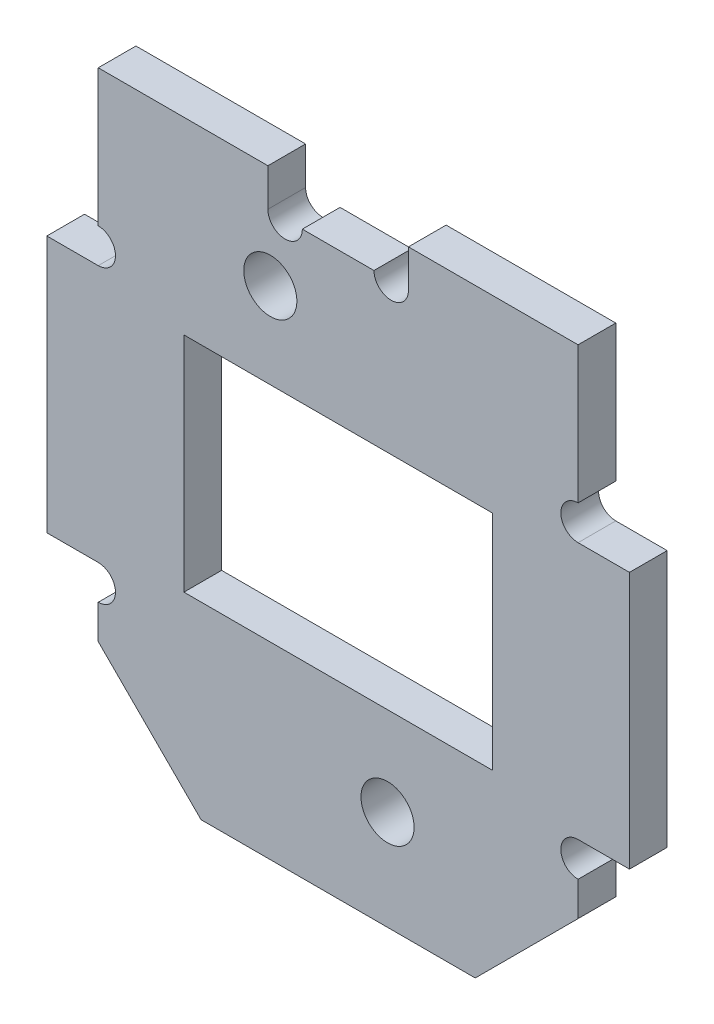
ISO-10303-21;
HEADER;
FILE_DESCRIPTION(('STEP AP214'),'2;1');
FILE_NAME('part.step','',(''),(''),'','','');
FILE_SCHEMA(('AUTOMOTIVE_DESIGN { 1 0 10303 214 1 1 1 1 }'));
ENDSEC;
DATA;
#1=APPLICATION_CONTEXT('core data for automotive mechanical design processes');
#2=APPLICATION_PROTOCOL_DEFINITION('international standard','automotive_design',2000,#1);
#3=PRODUCT_CONTEXT('',#1,'mechanical');
#4=PRODUCT('Part','Part','',(#3));
#5=PRODUCT_RELATED_PRODUCT_CATEGORY('part','',(#4));
#6=PRODUCT_DEFINITION_FORMATION('','',#4);
#7=PRODUCT_DEFINITION_CONTEXT('part definition',#1,'design');
#8=PRODUCT_DEFINITION('design','',#6,#7);
#9=PRODUCT_DEFINITION_SHAPE('','',#8);
#10=(LENGTH_UNIT() NAMED_UNIT(*) SI_UNIT(.MILLI.,.METRE.));
#11=(NAMED_UNIT(*) PLANE_ANGLE_UNIT() SI_UNIT($,.RADIAN.));
#12=(NAMED_UNIT(*) SI_UNIT($,.STERADIAN.) SOLID_ANGLE_UNIT());
#13=UNCERTAINTY_MEASURE_WITH_UNIT(LENGTH_MEASURE(1.E-05),#10,'distance_accuracy_value','');
#14=(GEOMETRIC_REPRESENTATION_CONTEXT(3) GLOBAL_UNCERTAINTY_ASSIGNED_CONTEXT((#13)) GLOBAL_UNIT_ASSIGNED_CONTEXT((#10,
#11,#12)) REPRESENTATION_CONTEXT('',''));
#15=CARTESIAN_POINT('',(0.,0.,0.));
#16=DIRECTION('',(0.,0.,1.));
#17=DIRECTION('',(1.,0.,0.));
#18=AXIS2_PLACEMENT_3D('',#15,#16,#17);
#19=CARTESIAN_POINT('',(0.,7.5,2.2));
#20=DIRECTION('',(0.,1.,0.));
#21=DIRECTION('',(0.,0.,1.));
#22=AXIS2_PLACEMENT_3D('',#19,#20,#21);
#23=PLANE('',#22);
#24=DIRECTION('',(1.,0.,0.));
#25=VECTOR('',#24,1.);
#26=CARTESIAN_POINT('',(0.,7.5,0.));
#27=LINE('',#26,#25);
#28=CARTESIAN_POINT('',(14.,7.5,0.));
#29=VERTEX_POINT('',#28);
#30=CARTESIAN_POINT('',(17.,7.5,0.));
#31=VERTEX_POINT('',#30);
#32=EDGE_CURVE('E366',#29,#31,#27,.T.);
#33=ORIENTED_EDGE('',*,*,#32,.F.);
#34=DIRECTION('',(0.,0.,-1.));
#35=VECTOR('',#34,1.);
#36=CARTESIAN_POINT('',(14.,7.5,2.2));
#37=LINE('',#36,#35);
#38=CARTESIAN_POINT('',(14.,7.5,2.2));
#39=VERTEX_POINT('',#38);
#40=EDGE_CURVE('E258',#39,#29,#37,.T.);
#41=ORIENTED_EDGE('',*,*,#40,.F.);
#42=DIRECTION('',(1.,0.,0.));
#43=VECTOR('',#42,1.);
#44=CARTESIAN_POINT('',(0.,7.5,2.2));
#45=LINE('',#44,#43);
#46=CARTESIAN_POINT('',(17.,7.5,2.2));
#47=VERTEX_POINT('',#46);
#48=EDGE_CURVE('E496',#39,#47,#45,.T.);
#49=ORIENTED_EDGE('',*,*,#48,.T.);
#50=DIRECTION('',(0.,0.,-1.));
#51=VECTOR('',#50,1.);
#52=CARTESIAN_POINT('',(17.,7.5,2.2));
#53=LINE('',#52,#51);
#54=EDGE_CURVE('E246',#47,#31,#53,.T.);
#55=ORIENTED_EDGE('',*,*,#54,.T.);
#56=EDGE_LOOP('',(#33,#41,#49,#55));
#57=FACE_BOUND('',#56,.T.);
#58=ADVANCED_FACE('F36',(#57),#23,.T.);
#59=CARTESIAN_POINT('',(14.,8.505,2.2));
#60=DIRECTION('',(0.,0.,-1.));
#61=DIRECTION('',(-1.,0.,0.));
#62=AXIS2_PLACEMENT_3D('',#59,#60,#61);
#63=CYLINDRICAL_SURFACE('',#62,1.005);
#64=CARTESIAN_POINT('',(14.,8.505,0.));
#65=DIRECTION('',(0.,0.,1.));
#66=DIRECTION('',(1.,0.,0.));
#67=AXIS2_PLACEMENT_3D('',#64,#65,#66);
#68=CIRCLE('',#67,1.005);
#69=CARTESIAN_POINT('',(14.,9.51,0.));
#70=VERTEX_POINT('',#69);
#71=EDGE_CURVE('E369',#29,#70,#68,.F.);
#72=ORIENTED_EDGE('',*,*,#71,.T.);
#73=DIRECTION('',(0.,0.,-1.));
#74=VECTOR('',#73,1.);
#75=CARTESIAN_POINT('',(14.,9.51,2.2));
#76=LINE('',#75,#74);
#77=CARTESIAN_POINT('',(14.,9.51,2.2));
#78=VERTEX_POINT('',#77);
#79=EDGE_CURVE('E347',#78,#70,#76,.T.);
#80=ORIENTED_EDGE('',*,*,#79,.F.);
#81=CARTESIAN_POINT('',(14.,8.505,2.2));
#82=DIRECTION('',(0.,0.,1.));
#83=DIRECTION('',(1.,0.,0.));
#84=AXIS2_PLACEMENT_3D('',#81,#82,#83);
#85=CIRCLE('',#84,1.005);
#86=EDGE_CURVE('E771',#39,#78,#85,.F.);
#87=ORIENTED_EDGE('',*,*,#86,.F.);
#88=ORIENTED_EDGE('',*,*,#40,.T.);
#89=EDGE_LOOP('',(#72,#80,#87,#88));
#90=FACE_BOUND('',#89,.T.);
#91=ADVANCED_FACE('F490',(#90),#63,.F.);
#92=CARTESIAN_POINT('',(14.,0.,2.2));
#93=DIRECTION('',(-1.,0.,0.));
#94=DIRECTION('',(0.,-1.,0.));
#95=AXIS2_PLACEMENT_3D('',#92,#93,#94);
#96=PLANE('',#95);
#97=DIRECTION('',(0.,1.,0.));
#98=VECTOR('',#97,1.);
#99=CARTESIAN_POINT('',(14.,0.,0.));
#100=LINE('',#99,#98);
#101=CARTESIAN_POINT('',(14.,17.5,0.));
#102=VERTEX_POINT('',#101);
#103=EDGE_CURVE('E375',#70,#102,#100,.T.);
#104=ORIENTED_EDGE('',*,*,#103,.T.);
#105=DIRECTION('',(0.,0.,-1.));
#106=VECTOR('',#105,1.);
#107=CARTESIAN_POINT('',(14.,17.5,2.2));
#108=LINE('',#107,#106);
#109=CARTESIAN_POINT('',(14.,17.5,2.2));
#110=VERTEX_POINT('',#109);
#111=EDGE_CURVE('E344',#110,#102,#108,.T.);
#112=ORIENTED_EDGE('',*,*,#111,.F.);
#113=DIRECTION('',(0.,1.,0.));
#114=VECTOR('',#113,1.);
#115=CARTESIAN_POINT('',(14.,0.,2.2));
#116=LINE('',#115,#114);
#117=EDGE_CURVE('E486',#78,#110,#116,.T.);
#118=ORIENTED_EDGE('',*,*,#117,.F.);
#119=ORIENTED_EDGE('',*,*,#79,.T.);
#120=EDGE_LOOP('',(#104,#112,#118,#119));
#121=FACE_BOUND('',#120,.T.);
#122=ADVANCED_FACE('F484',(#121),#96,.F.);
#123=CARTESIAN_POINT('',(0.,17.5,2.2));
#124=DIRECTION('',(0.,-1.,0.));
#125=DIRECTION('',(1.,0.,0.));
#126=AXIS2_PLACEMENT_3D('',#123,#124,#125);
#127=PLANE('',#126);
#128=DIRECTION('',(-1.,0.,0.));
#129=VECTOR('',#128,1.);
#130=CARTESIAN_POINT('',(0.,17.5,0.));
#131=LINE('',#130,#129);
#132=CARTESIAN_POINT('',(4.1,17.5,0.));
#133=VERTEX_POINT('',#132);
#134=EDGE_CURVE('E378',#102,#133,#131,.T.);
#135=ORIENTED_EDGE('',*,*,#134,.T.);
#136=DIRECTION('',(0.,0.,-1.));
#137=VECTOR('',#136,1.);
#138=CARTESIAN_POINT('',(4.1,17.5,2.2));
#139=LINE('',#138,#137);
#140=CARTESIAN_POINT('',(4.1,17.5,2.2));
#141=VERTEX_POINT('',#140);
#142=EDGE_CURVE('E342',#141,#133,#139,.T.);
#143=ORIENTED_EDGE('',*,*,#142,.F.);
#144=DIRECTION('',(-1.,0.,0.));
#145=VECTOR('',#144,1.);
#146=CARTESIAN_POINT('',(0.,17.5,2.2));
#147=LINE('',#146,#145);
#148=EDGE_CURVE('E481',#110,#141,#147,.T.);
#149=ORIENTED_EDGE('',*,*,#148,.F.);
#150=ORIENTED_EDGE('',*,*,#111,.T.);
#151=EDGE_LOOP('',(#135,#143,#149,#150));
#152=FACE_BOUND('',#151,.T.);
#153=ADVANCED_FACE('F480',(#152),#127,.F.);
#154=CARTESIAN_POINT('',(4.1,0.,2.2));
#155=DIRECTION('',(-1.,0.,0.));
#156=DIRECTION('',(0.,0.,1.));
#157=AXIS2_PLACEMENT_3D('',#154,#155,#156);
#158=PLANE('',#157);
#159=DIRECTION('',(0.,1.,0.));
#160=VECTOR('',#159,1.);
#161=CARTESIAN_POINT('',(4.1,0.,0.));
#162=LINE('',#161,#160);
#163=CARTESIAN_POINT('',(4.1,15.3,0.));
#164=VERTEX_POINT('',#163);
#165=EDGE_CURVE('E381',#164,#133,#162,.T.);
#166=ORIENTED_EDGE('',*,*,#165,.F.);
#167=DIRECTION('',(0.,0.,-1.));
#168=VECTOR('',#167,1.);
#169=CARTESIAN_POINT('',(4.1,15.3,2.2));
#170=LINE('',#169,#168);
#171=CARTESIAN_POINT('',(4.1,15.3,2.2));
#172=VERTEX_POINT('',#171);
#173=EDGE_CURVE('E340',#172,#164,#170,.T.);
#174=ORIENTED_EDGE('',*,*,#173,.F.);
#175=DIRECTION('',(0.,1.,0.));
#176=VECTOR('',#175,1.);
#177=CARTESIAN_POINT('',(4.1,0.,2.2));
#178=LINE('',#177,#176);
#179=EDGE_CURVE('E767',#172,#141,#178,.T.);
#180=ORIENTED_EDGE('',*,*,#179,.T.);
#181=ORIENTED_EDGE('',*,*,#142,.T.);
#182=EDGE_LOOP('',(#166,#174,#180,#181));
#183=FACE_BOUND('',#182,.T.);
#184=ADVANCED_FACE('F475',(#183),#158,.T.);
#185=CARTESIAN_POINT('',(3.095,15.3,2.2));
#186=DIRECTION('',(0.,0.,-1.));
#187=DIRECTION('',(-1.,0.,0.));
#188=AXIS2_PLACEMENT_3D('',#185,#186,#187);
#189=CYLINDRICAL_SURFACE('',#188,1.005);
#190=CARTESIAN_POINT('',(3.095,15.3,0.));
#191=DIRECTION('',(0.,0.,1.));
#192=DIRECTION('',(1.,0.,0.));
#193=AXIS2_PLACEMENT_3D('',#190,#191,#192);
#194=CIRCLE('',#193,1.005);
#195=CARTESIAN_POINT('',(2.09,15.3,0.));
#196=VERTEX_POINT('',#195);
#197=EDGE_CURVE('E384',#196,#164,#194,.T.);
#198=ORIENTED_EDGE('',*,*,#197,.F.);
#199=DIRECTION('',(0.,0.,-1.));
#200=VECTOR('',#199,1.);
#201=CARTESIAN_POINT('',(2.09,15.3,2.2));
#202=LINE('',#201,#200);
#203=CARTESIAN_POINT('',(2.09,15.3,2.2));
#204=VERTEX_POINT('',#203);
#205=EDGE_CURVE('E338',#204,#196,#202,.T.);
#206=ORIENTED_EDGE('',*,*,#205,.F.);
#207=CARTESIAN_POINT('',(3.095,15.3,2.2));
#208=DIRECTION('',(0.,0.,1.));
#209=DIRECTION('',(1.,0.,0.));
#210=AXIS2_PLACEMENT_3D('',#207,#208,#209);
#211=CIRCLE('',#210,1.005);
#212=EDGE_CURVE('E471',#204,#172,#211,.T.);
#213=ORIENTED_EDGE('',*,*,#212,.T.);
#214=ORIENTED_EDGE('',*,*,#173,.T.);
#215=EDGE_LOOP('',(#198,#206,#213,#214));
#216=FACE_BOUND('',#215,.T.);
#217=ADVANCED_FACE('F469',(#216),#189,.F.);
#218=CARTESIAN_POINT('',(0.,15.3,2.2));
#219=DIRECTION('',(0.,1.,0.));
#220=DIRECTION('',(0.,0.,1.));
#221=AXIS2_PLACEMENT_3D('',#218,#219,#220);
#222=PLANE('',#221);
#223=DIRECTION('',(1.,0.,0.));
#224=VECTOR('',#223,1.);
#225=CARTESIAN_POINT('',(0.,15.3,0.));
#226=LINE('',#225,#224);
#227=CARTESIAN_POINT('',(-2.09,15.3,0.));
#228=VERTEX_POINT('',#227);
#229=EDGE_CURVE('E387',#228,#196,#226,.T.);
#230=ORIENTED_EDGE('',*,*,#229,.F.);
#231=DIRECTION('',(0.,0.,-1.));
#232=VECTOR('',#231,1.);
#233=CARTESIAN_POINT('',(-2.09,15.3,2.2));
#234=LINE('',#233,#232);
#235=CARTESIAN_POINT('',(-2.09,15.3,2.2));
#236=VERTEX_POINT('',#235);
#237=EDGE_CURVE('E336',#236,#228,#234,.T.);
#238=ORIENTED_EDGE('',*,*,#237,.F.);
#239=DIRECTION('',(1.,0.,0.));
#240=VECTOR('',#239,1.);
#241=CARTESIAN_POINT('',(0.,15.3,2.2));
#242=LINE('',#241,#240);
#243=EDGE_CURVE('E465',#236,#204,#242,.T.);
#244=ORIENTED_EDGE('',*,*,#243,.T.);
#245=ORIENTED_EDGE('',*,*,#205,.T.);
#246=EDGE_LOOP('',(#230,#238,#244,#245));
#247=FACE_BOUND('',#246,.T.);
#248=ADVANCED_FACE('F462',(#247),#222,.T.);
#249=CARTESIAN_POINT('',(-3.095,15.3,2.2));
#250=DIRECTION('',(0.,0.,-1.));
#251=DIRECTION('',(-1.,0.,0.));
#252=AXIS2_PLACEMENT_3D('',#249,#250,#251);
#253=CYLINDRICAL_SURFACE('',#252,1.005);
#254=CARTESIAN_POINT('',(-3.095,15.3,0.));
#255=DIRECTION('',(0.,0.,1.));
#256=DIRECTION('',(1.,0.,0.));
#257=AXIS2_PLACEMENT_3D('',#254,#255,#256);
#258=CIRCLE('',#257,1.005);
#259=CARTESIAN_POINT('',(-4.1,15.3,0.));
#260=VERTEX_POINT('',#259);
#261=EDGE_CURVE('E390',#260,#228,#258,.T.);
#262=ORIENTED_EDGE('',*,*,#261,.F.);
#263=DIRECTION('',(0.,0.,-1.));
#264=VECTOR('',#263,1.);
#265=CARTESIAN_POINT('',(-4.1,15.3,2.2));
#266=LINE('',#265,#264);
#267=CARTESIAN_POINT('',(-4.1,15.3,2.2));
#268=VERTEX_POINT('',#267);
#269=EDGE_CURVE('E334',#268,#260,#266,.T.);
#270=ORIENTED_EDGE('',*,*,#269,.F.);
#271=CARTESIAN_POINT('',(-3.095,15.3,2.2));
#272=DIRECTION('',(0.,0.,1.));
#273=DIRECTION('',(1.,0.,0.));
#274=AXIS2_PLACEMENT_3D('',#271,#272,#273);
#275=CIRCLE('',#274,1.005);
#276=EDGE_CURVE('E763',#268,#236,#275,.T.);
#277=ORIENTED_EDGE('',*,*,#276,.T.);
#278=ORIENTED_EDGE('',*,*,#237,.T.);
#279=EDGE_LOOP('',(#262,#270,#277,#278));
#280=FACE_BOUND('',#279,.T.);
#281=ADVANCED_FACE('F458',(#280),#253,.F.);
#282=CARTESIAN_POINT('',(-4.1,0.,2.2));
#283=DIRECTION('',(1.,0.,0.));
#284=DIRECTION('',(0.,0.,-1.));
#285=AXIS2_PLACEMENT_3D('',#282,#283,#284);
#286=PLANE('',#285);
#287=DIRECTION('',(0.,-1.,0.));
#288=VECTOR('',#287,1.);
#289=CARTESIAN_POINT('',(-4.1,0.,0.));
#290=LINE('',#289,#288);
#291=CARTESIAN_POINT('',(-4.1,17.5,0.));
#292=VERTEX_POINT('',#291);
#293=EDGE_CURVE('E393',#292,#260,#290,.T.);
#294=ORIENTED_EDGE('',*,*,#293,.F.);
#295=DIRECTION('',(0.,0.,-1.));
#296=VECTOR('',#295,1.);
#297=CARTESIAN_POINT('',(-4.1,17.5,2.2));
#298=LINE('',#297,#296);
#299=CARTESIAN_POINT('',(-4.1,17.5,2.2));
#300=VERTEX_POINT('',#299);
#301=EDGE_CURVE('E332',#300,#292,#298,.T.);
#302=ORIENTED_EDGE('',*,*,#301,.F.);
#303=DIRECTION('',(0.,-1.,0.));
#304=VECTOR('',#303,1.);
#305=CARTESIAN_POINT('',(-4.1,0.,2.2));
#306=LINE('',#305,#304);
#307=EDGE_CURVE('E454',#300,#268,#306,.T.);
#308=ORIENTED_EDGE('',*,*,#307,.T.);
#309=ORIENTED_EDGE('',*,*,#269,.T.);
#310=EDGE_LOOP('',(#294,#302,#308,#309));
#311=FACE_BOUND('',#310,.T.);
#312=ADVANCED_FACE('F449',(#311),#286,.T.);
#313=CARTESIAN_POINT('',(0.,17.5,2.2));
#314=DIRECTION('',(0.,-1.,0.));
#315=DIRECTION('',(1.,0.,0.));
#316=AXIS2_PLACEMENT_3D('',#313,#314,#315);
#317=PLANE('',#316);
#318=DIRECTION('',(-1.,0.,0.));
#319=VECTOR('',#318,1.);
#320=CARTESIAN_POINT('',(0.,17.5,0.));
#321=LINE('',#320,#319);
#322=CARTESIAN_POINT('',(-14.,17.5,0.));
#323=VERTEX_POINT('',#322);
#324=EDGE_CURVE('E396',#292,#323,#321,.T.);
#325=ORIENTED_EDGE('',*,*,#324,.T.);
#326=DIRECTION('',(0.,0.,-1.));
#327=VECTOR('',#326,1.);
#328=CARTESIAN_POINT('',(-14.,17.5,2.2));
#329=LINE('',#328,#327);
#330=CARTESIAN_POINT('',(-14.,17.5,2.2));
#331=VERTEX_POINT('',#330);
#332=EDGE_CURVE('E330',#331,#323,#329,.T.);
#333=ORIENTED_EDGE('',*,*,#332,.F.);
#334=DIRECTION('',(-1.,0.,0.));
#335=VECTOR('',#334,1.);
#336=CARTESIAN_POINT('',(0.,17.5,2.2));
#337=LINE('',#336,#335);
#338=EDGE_CURVE('E760',#300,#331,#337,.T.);
#339=ORIENTED_EDGE('',*,*,#338,.F.);
#340=ORIENTED_EDGE('',*,*,#301,.T.);
#341=EDGE_LOOP('',(#325,#333,#339,#340));
#342=FACE_BOUND('',#341,.T.);
#343=ADVANCED_FACE('F581',(#342),#317,.F.);
#344=CARTESIAN_POINT('',(-14.,0.,2.2));
#345=DIRECTION('',(-1.,0.,0.));
#346=DIRECTION('',(0.,0.,1.));
#347=AXIS2_PLACEMENT_3D('',#344,#345,#346);
#348=PLANE('',#347);
#349=DIRECTION('',(0.,1.,0.));
#350=VECTOR('',#349,1.);
#351=CARTESIAN_POINT('',(-14.,0.,0.));
#352=LINE('',#351,#350);
#353=CARTESIAN_POINT('',(-14.,9.51,0.));
#354=VERTEX_POINT('',#353);
#355=EDGE_CURVE('E399',#354,#323,#352,.T.);
#356=ORIENTED_EDGE('',*,*,#355,.F.);
#357=DIRECTION('',(0.,0.,-1.));
#358=VECTOR('',#357,1.);
#359=CARTESIAN_POINT('',(-14.,9.51,2.2));
#360=LINE('',#359,#358);
#361=CARTESIAN_POINT('',(-14.,9.51,2.2));
#362=VERTEX_POINT('',#361);
#363=EDGE_CURVE('E328',#362,#354,#360,.T.);
#364=ORIENTED_EDGE('',*,*,#363,.F.);
#365=DIRECTION('',(0.,1.,0.));
#366=VECTOR('',#365,1.);
#367=CARTESIAN_POINT('',(-14.,0.,2.2));
#368=LINE('',#367,#366);
#369=EDGE_CURVE('E758',#362,#331,#368,.T.);
#370=ORIENTED_EDGE('',*,*,#369,.T.);
#371=ORIENTED_EDGE('',*,*,#332,.T.);
#372=EDGE_LOOP('',(#356,#364,#370,#371));
#373=FACE_BOUND('',#372,.T.);
#374=ADVANCED_FACE('F443',(#373),#348,.T.);
#375=CARTESIAN_POINT('',(-14.,8.505,2.2));
#376=DIRECTION('',(0.,0.,-1.));
#377=DIRECTION('',(-1.,0.,0.));
#378=AXIS2_PLACEMENT_3D('',#375,#376,#377);
#379=CYLINDRICAL_SURFACE('',#378,1.005);
#380=CARTESIAN_POINT('',(-14.,8.505,0.));
#381=DIRECTION('',(0.,0.,1.));
#382=DIRECTION('',(1.,0.,0.));
#383=AXIS2_PLACEMENT_3D('',#380,#381,#382);
#384=CIRCLE('',#383,1.005);
#385=CARTESIAN_POINT('',(-14.,7.5,0.));
#386=VERTEX_POINT('',#385);
#387=EDGE_CURVE('E402',#386,#354,#384,.T.);
#388=ORIENTED_EDGE('',*,*,#387,.F.);
#389=DIRECTION('',(0.,0.,-1.));
#390=VECTOR('',#389,1.);
#391=CARTESIAN_POINT('',(-14.,7.5,2.2));
#392=LINE('',#391,#390);
#393=CARTESIAN_POINT('',(-14.,7.5,2.2));
#394=VERTEX_POINT('',#393);
#395=EDGE_CURVE('E326',#394,#386,#392,.T.);
#396=ORIENTED_EDGE('',*,*,#395,.F.);
#397=CARTESIAN_POINT('',(-14.,8.505,2.2));
#398=DIRECTION('',(0.,0.,1.));
#399=DIRECTION('',(1.,0.,0.));
#400=AXIS2_PLACEMENT_3D('',#397,#398,#399);
#401=CIRCLE('',#400,1.005);
#402=EDGE_CURVE('E439',#394,#362,#401,.T.);
#403=ORIENTED_EDGE('',*,*,#402,.T.);
#404=ORIENTED_EDGE('',*,*,#363,.T.);
#405=EDGE_LOOP('',(#388,#396,#403,#404));
#406=FACE_BOUND('',#405,.T.);
#407=ADVANCED_FACE('F434',(#406),#379,.F.);
#408=CARTESIAN_POINT('',(0.,7.5,2.2));
#409=DIRECTION('',(0.,-1.,0.));
#410=DIRECTION('',(0.,0.,-1.));
#411=AXIS2_PLACEMENT_3D('',#408,#409,#410);
#412=PLANE('',#411);
#413=DIRECTION('',(-1.,0.,0.));
#414=VECTOR('',#413,1.);
#415=CARTESIAN_POINT('',(0.,7.5,0.));
#416=LINE('',#415,#414);
#417=CARTESIAN_POINT('',(-17.,7.5,0.));
#418=VERTEX_POINT('',#417);
#419=EDGE_CURVE('E405',#386,#418,#416,.T.);
#420=ORIENTED_EDGE('',*,*,#419,.T.);
#421=DIRECTION('',(0.,0.,-1.));
#422=VECTOR('',#421,1.);
#423=CARTESIAN_POINT('',(-17.,7.5,2.2));
#424=LINE('',#423,#422);
#425=CARTESIAN_POINT('',(-17.,7.5,2.2));
#426=VERTEX_POINT('',#425);
#427=EDGE_CURVE('E323',#426,#418,#424,.T.);
#428=ORIENTED_EDGE('',*,*,#427,.F.);
#429=DIRECTION('',(-1.,0.,0.));
#430=VECTOR('',#429,1.);
#431=CARTESIAN_POINT('',(0.,7.5,2.2));
#432=LINE('',#431,#430);
#433=EDGE_CURVE('E754',#394,#426,#432,.T.);
#434=ORIENTED_EDGE('',*,*,#433,.F.);
#435=ORIENTED_EDGE('',*,*,#395,.T.);
#436=EDGE_LOOP('',(#420,#428,#434,#435));
#437=FACE_BOUND('',#436,.T.);
#438=ADVANCED_FACE('F574',(#437),#412,.F.);
#439=CARTESIAN_POINT('',(-17.,0.,2.2));
#440=DIRECTION('',(1.,0.,0.));
#441=DIRECTION('',(0.,0.,-1.));
#442=AXIS2_PLACEMENT_3D('',#439,#440,#441);
#443=PLANE('',#442);
#444=DIRECTION('',(0.,-1.,0.));
#445=VECTOR('',#444,1.);
#446=CARTESIAN_POINT('',(-17.,0.,0.));
#447=LINE('',#446,#445);
#448=CARTESIAN_POINT('',(-17.,-7.5,0.));
#449=VERTEX_POINT('',#448);
#450=EDGE_CURVE('E408',#418,#449,#447,.T.);
#451=ORIENTED_EDGE('',*,*,#450,.T.);
#452=DIRECTION('',(0.,0.,-1.));
#453=VECTOR('',#452,1.);
#454=CARTESIAN_POINT('',(-17.,-7.5,2.2));
#455=LINE('',#454,#453);
#456=CARTESIAN_POINT('',(-17.,-7.5,2.2));
#457=VERTEX_POINT('',#456);
#458=EDGE_CURVE('E320',#457,#449,#455,.T.);
#459=ORIENTED_EDGE('',*,*,#458,.F.);
#460=DIRECTION('',(0.,-1.,0.));
#461=VECTOR('',#460,1.);
#462=CARTESIAN_POINT('',(-17.,0.,2.2));
#463=LINE('',#462,#461);
#464=EDGE_CURVE('E752',#426,#457,#463,.T.);
#465=ORIENTED_EDGE('',*,*,#464,.F.);
#466=ORIENTED_EDGE('',*,*,#427,.T.);
#467=EDGE_LOOP('',(#451,#459,#465,#466));
#468=FACE_BOUND('',#467,.T.);
#469=ADVANCED_FACE('F428',(#468),#443,.F.);
#470=CARTESIAN_POINT('',(0.,-7.5,2.2));
#471=DIRECTION('',(0.,1.,0.));
#472=DIRECTION('',(0.,0.,1.));
#473=AXIS2_PLACEMENT_3D('',#470,#471,#472);
#474=PLANE('',#473);
#475=DIRECTION('',(1.,0.,0.));
#476=VECTOR('',#475,1.);
#477=CARTESIAN_POINT('',(0.,-7.5,0.));
#478=LINE('',#477,#476);
#479=CARTESIAN_POINT('',(-14.,-7.5,0.));
#480=VERTEX_POINT('',#479);
#481=EDGE_CURVE('E411',#449,#480,#478,.T.);
#482=ORIENTED_EDGE('',*,*,#481,.T.);
#483=DIRECTION('',(0.,0.,-1.));
#484=VECTOR('',#483,1.);
#485=CARTESIAN_POINT('',(-14.,-7.5,2.2));
#486=LINE('',#485,#484);
#487=CARTESIAN_POINT('',(-14.,-7.5,2.2));
#488=VERTEX_POINT('',#487);
#489=EDGE_CURVE('E318',#488,#480,#486,.T.);
#490=ORIENTED_EDGE('',*,*,#489,.F.);
#491=DIRECTION('',(1.,0.,0.));
#492=VECTOR('',#491,1.);
#493=CARTESIAN_POINT('',(0.,-7.5,2.2));
#494=LINE('',#493,#492);
#495=EDGE_CURVE('E425',#457,#488,#494,.T.);
#496=ORIENTED_EDGE('',*,*,#495,.F.);
#497=ORIENTED_EDGE('',*,*,#458,.T.);
#498=EDGE_LOOP('',(#482,#490,#496,#497));
#499=FACE_BOUND('',#498,.T.);
#500=ADVANCED_FACE('F423',(#499),#474,.F.);
#501=CARTESIAN_POINT('',(-14.,-8.505,2.2));
#502=DIRECTION('',(0.,0.,-1.));
#503=DIRECTION('',(-1.,0.,0.));
#504=AXIS2_PLACEMENT_3D('',#501,#502,#503);
#505=CYLINDRICAL_SURFACE('',#504,1.005);
#506=CARTESIAN_POINT('',(-14.,-8.505,0.));
#507=DIRECTION('',(0.,0.,1.));
#508=DIRECTION('',(1.,0.,0.));
#509=AXIS2_PLACEMENT_3D('',#506,#507,#508);
#510=CIRCLE('',#509,1.005);
#511=CARTESIAN_POINT('',(-14.,-9.51,0.));
#512=VERTEX_POINT('',#511);
#513=EDGE_CURVE('E298',#512,#480,#510,.T.);
#514=ORIENTED_EDGE('',*,*,#513,.F.);
#515=DIRECTION('',(0.,0.,-1.));
#516=VECTOR('',#515,1.);
#517=CARTESIAN_POINT('',(-14.,-9.51,2.2));
#518=LINE('',#517,#516);
#519=CARTESIAN_POINT('',(-14.,-9.51,2.2));
#520=VERTEX_POINT('',#519);
#521=EDGE_CURVE('E315',#520,#512,#518,.T.);
#522=ORIENTED_EDGE('',*,*,#521,.F.);
#523=CARTESIAN_POINT('',(-14.,-8.505,2.2));
#524=DIRECTION('',(0.,0.,1.));
#525=DIRECTION('',(1.,0.,0.));
#526=AXIS2_PLACEMENT_3D('',#523,#524,#525);
#527=CIRCLE('',#526,1.005);
#528=EDGE_CURVE('E421',#520,#488,#527,.T.);
#529=ORIENTED_EDGE('',*,*,#528,.T.);
#530=ORIENTED_EDGE('',*,*,#489,.T.);
#531=EDGE_LOOP('',(#514,#522,#529,#530));
#532=FACE_BOUND('',#531,.T.);
#533=ADVANCED_FACE('F417',(#532),#505,.F.);
#534=CARTESIAN_POINT('',(-14.,0.,2.2));
#535=DIRECTION('',(-1.,0.,0.));
#536=DIRECTION('',(0.,-1.,0.));
#537=AXIS2_PLACEMENT_3D('',#534,#535,#536);
#538=PLANE('',#537);
#539=DIRECTION('',(0.,1.,0.));
#540=VECTOR('',#539,1.);
#541=CARTESIAN_POINT('',(-14.,0.,0.));
#542=LINE('',#541,#540);
#543=CARTESIAN_POINT('',(-14.,-11.5,0.));
#544=VERTEX_POINT('',#543);
#545=EDGE_CURVE('E294',#544,#512,#542,.T.);
#546=ORIENTED_EDGE('',*,*,#545,.F.);
#547=DIRECTION('',(0.,0.,1.));
#548=VECTOR('',#547,1.);
#549=CARTESIAN_POINT('',(-14.,-11.5,2.2));
#550=LINE('',#549,#548);
#551=CARTESIAN_POINT('',(-14.,-11.5,2.2));
#552=VERTEX_POINT('',#551);
#553=EDGE_CURVE('E11',#544,#552,#550,.T.);
#554=ORIENTED_EDGE('',*,*,#553,.T.);
#555=DIRECTION('',(0.,1.,0.));
#556=VECTOR('',#555,1.);
#557=CARTESIAN_POINT('',(-14.,0.,2.2));
#558=LINE('',#557,#556);
#559=EDGE_CURVE('E747',#552,#520,#558,.T.);
#560=ORIENTED_EDGE('',*,*,#559,.T.);
#561=ORIENTED_EDGE('',*,*,#521,.T.);
#562=EDGE_LOOP('',(#546,#554,#560,#561));
#563=FACE_BOUND('',#562,.T.);
#564=ADVANCED_FACE('F565',(#563),#538,.T.);
#565=CARTESIAN_POINT('',(0.,-17.5,2.2));
#566=DIRECTION('',(0.,-1.,0.));
#567=DIRECTION('',(0.,0.,-1.));
#568=AXIS2_PLACEMENT_3D('',#565,#566,#567);
#569=PLANE('',#568);
#570=DIRECTION('',(-1.,0.,0.));
#571=VECTOR('',#570,1.);
#572=CARTESIAN_POINT('',(0.,-17.5,0.));
#573=LINE('',#572,#571);
#574=CARTESIAN_POINT('',(7.99999999999997,-17.5,0.));
#575=VERTEX_POINT('',#574);
#576=CARTESIAN_POINT('',(-8.,-17.5,0.));
#577=VERTEX_POINT('',#576);
#578=EDGE_CURVE('E288',#575,#577,#573,.T.);
#579=ORIENTED_EDGE('',*,*,#578,.F.);
#580=DIRECTION('',(0.,0.,1.));
#581=VECTOR('',#580,1.);
#582=CARTESIAN_POINT('',(7.99999999999997,-17.5,2.2));
#583=LINE('',#582,#581);
#584=CARTESIAN_POINT('',(7.99999999999997,-17.5,2.2));
#585=VERTEX_POINT('',#584);
#586=EDGE_CURVE('E265',#575,#585,#583,.T.);
#587=ORIENTED_EDGE('',*,*,#586,.T.);
#588=DIRECTION('',(-1.,0.,0.));
#589=VECTOR('',#588,1.);
#590=CARTESIAN_POINT('',(0.,-17.5,2.2));
#591=LINE('',#590,#589);
#592=CARTESIAN_POINT('',(-8.,-17.5,2.2));
#593=VERTEX_POINT('',#592);
#594=EDGE_CURVE('E271',#585,#593,#591,.T.);
#595=ORIENTED_EDGE('',*,*,#594,.T.);
#596=DIRECTION('',(0.,0.,-1.));
#597=VECTOR('',#596,1.);
#598=CARTESIAN_POINT('',(-8.,-17.5,2.2));
#599=LINE('',#598,#597);
#600=EDGE_CURVE('E262',#593,#577,#599,.T.);
#601=ORIENTED_EDGE('',*,*,#600,.T.);
#602=EDGE_LOOP('',(#579,#587,#595,#601));
#603=FACE_BOUND('',#602,.T.);
#604=ADVANCED_FACE('F292',(#603),#569,.T.);
#605=CARTESIAN_POINT('',(14.,0.,2.2));
#606=DIRECTION('',(-1.,0.,0.));
#607=DIRECTION('',(0.,-1.,0.));
#608=AXIS2_PLACEMENT_3D('',#605,#606,#607);
#609=PLANE('',#608);
#610=DIRECTION('',(0.,1.,0.));
#611=VECTOR('',#610,1.);
#612=CARTESIAN_POINT('',(14.,0.,2.2));
#613=LINE('',#612,#611);
#614=CARTESIAN_POINT('',(14.,-11.5,2.2));
#615=VERTEX_POINT('',#614);
#616=CARTESIAN_POINT('',(14.,-9.51,2.2));
#617=VERTEX_POINT('',#616);
#618=EDGE_CURVE('E269',#615,#617,#613,.T.);
#619=ORIENTED_EDGE('',*,*,#618,.F.);
#620=DIRECTION('',(0.,0.,-1.));
#621=VECTOR('',#620,1.);
#622=CARTESIAN_POINT('',(14.,-11.5,0.));
#623=LINE('',#622,#621);
#624=CARTESIAN_POINT('',(14.,-11.5,0.));
#625=VERTEX_POINT('',#624);
#626=EDGE_CURVE('E254',#615,#625,#623,.T.);
#627=ORIENTED_EDGE('',*,*,#626,.T.);
#628=DIRECTION('',(0.,1.,0.));
#629=VECTOR('',#628,1.);
#630=CARTESIAN_POINT('',(14.,0.,0.));
#631=LINE('',#630,#629);
#632=CARTESIAN_POINT('',(14.,-9.51,0.));
#633=VERTEX_POINT('',#632);
#634=EDGE_CURVE('E290',#625,#633,#631,.T.);
#635=ORIENTED_EDGE('',*,*,#634,.T.);
#636=DIRECTION('',(0.,0.,-1.));
#637=VECTOR('',#636,1.);
#638=CARTESIAN_POINT('',(14.,-9.51,2.2));
#639=LINE('',#638,#637);
#640=EDGE_CURVE('E280',#617,#633,#639,.T.);
#641=ORIENTED_EDGE('',*,*,#640,.F.);
#642=EDGE_LOOP('',(#619,#627,#635,#641));
#643=FACE_BOUND('',#642,.T.);
#644=ADVANCED_FACE('F277',(#643),#609,.F.);
#645=CARTESIAN_POINT('',(14.,-8.505,2.2));
#646=DIRECTION('',(0.,0.,-1.));
#647=DIRECTION('',(-1.,0.,0.));
#648=AXIS2_PLACEMENT_3D('',#645,#646,#647);
#649=CYLINDRICAL_SURFACE('',#648,1.005);
#650=CARTESIAN_POINT('',(14.,-8.505,0.));
#651=DIRECTION('',(0.,0.,1.));
#652=DIRECTION('',(1.,0.,0.));
#653=AXIS2_PLACEMENT_3D('',#650,#651,#652);
#654=CIRCLE('',#653,1.005);
#655=CARTESIAN_POINT('',(14.,-7.5,0.));
#656=VERTEX_POINT('',#655);
#657=EDGE_CURVE('E296',#633,#656,#654,.F.);
#658=ORIENTED_EDGE('',*,*,#657,.T.);
#659=DIRECTION('',(0.,0.,-1.));
#660=VECTOR('',#659,1.);
#661=CARTESIAN_POINT('',(14.,-7.5,2.2));
#662=LINE('',#661,#660);
#663=CARTESIAN_POINT('',(14.,-7.5,2.2));
#664=VERTEX_POINT('',#663);
#665=EDGE_CURVE('E312',#664,#656,#662,.T.);
#666=ORIENTED_EDGE('',*,*,#665,.F.);
#667=CARTESIAN_POINT('',(14.,-8.505,2.2));
#668=DIRECTION('',(0.,0.,1.));
#669=DIRECTION('',(1.,0.,0.));
#670=AXIS2_PLACEMENT_3D('',#667,#668,#669);
#671=CIRCLE('',#670,1.005);
#672=EDGE_CURVE('E281',#617,#664,#671,.F.);
#673=ORIENTED_EDGE('',*,*,#672,.F.);
#674=ORIENTED_EDGE('',*,*,#640,.T.);
#675=EDGE_LOOP('',(#658,#666,#673,#674));
#676=FACE_BOUND('',#675,.T.);
#677=ADVANCED_FACE('F509',(#676),#649,.F.);
#678=CARTESIAN_POINT('',(0.,-7.5,2.2));
#679=DIRECTION('',(0.,-1.,0.));
#680=DIRECTION('',(0.,0.,-1.));
#681=AXIS2_PLACEMENT_3D('',#678,#679,#680);
#682=PLANE('',#681);
#683=DIRECTION('',(-1.,0.,0.));
#684=VECTOR('',#683,1.);
#685=CARTESIAN_POINT('',(0.,-7.5,0.));
#686=LINE('',#685,#684);
#687=CARTESIAN_POINT('',(17.,-7.5,0.));
#688=VERTEX_POINT('',#687);
#689=EDGE_CURVE('E304',#688,#656,#686,.T.);
#690=ORIENTED_EDGE('',*,*,#689,.F.);
#691=DIRECTION('',(0.,0.,-1.));
#692=VECTOR('',#691,1.);
#693=CARTESIAN_POINT('',(17.,-7.5,2.2));
#694=LINE('',#693,#692);
#695=CARTESIAN_POINT('',(17.,-7.5,2.2));
#696=VERTEX_POINT('',#695);
#697=EDGE_CURVE('E248',#696,#688,#694,.T.);
#698=ORIENTED_EDGE('',*,*,#697,.F.);
#699=DIRECTION('',(-1.,0.,0.));
#700=VECTOR('',#699,1.);
#701=CARTESIAN_POINT('',(0.,-7.5,2.2));
#702=LINE('',#701,#700);
#703=EDGE_CURVE('E507',#696,#664,#702,.T.);
#704=ORIENTED_EDGE('',*,*,#703,.T.);
#705=ORIENTED_EDGE('',*,*,#665,.T.);
#706=EDGE_LOOP('',(#690,#698,#704,#705));
#707=FACE_BOUND('',#706,.T.);
#708=ADVANCED_FACE('F503',(#707),#682,.T.);
#709=CARTESIAN_POINT('',(0.,-6.5,2.2));
#710=DIRECTION('',(0.,-1.,0.));
#711=DIRECTION('',(0.,0.,-1.));
#712=AXIS2_PLACEMENT_3D('',#709,#710,#711);
#713=PLANE('',#712);
#714=DIRECTION('',(-1.,0.,0.));
#715=VECTOR('',#714,1.);
#716=CARTESIAN_POINT('',(0.,-6.5,0.));
#717=LINE('',#716,#715);
#718=CARTESIAN_POINT('',(9.,-6.5,0.));
#719=VERTEX_POINT('',#718);
#720=CARTESIAN_POINT('',(-9.,-6.5,0.));
#721=VERTEX_POINT('',#720);
#722=EDGE_CURVE('E245',#719,#721,#717,.T.);
#723=ORIENTED_EDGE('',*,*,#722,.T.);
#724=DIRECTION('',(0.,0.,-1.));
#725=VECTOR('',#724,1.);
#726=CARTESIAN_POINT('',(-9.,-6.5,2.2));
#727=LINE('',#726,#725);
#728=CARTESIAN_POINT('',(-9.,-6.5,2.2));
#729=VERTEX_POINT('',#728);
#730=EDGE_CURVE('E226',#729,#721,#727,.T.);
#731=ORIENTED_EDGE('',*,*,#730,.F.);
#732=DIRECTION('',(-1.,0.,0.));
#733=VECTOR('',#732,1.);
#734=CARTESIAN_POINT('',(0.,-6.5,2.2));
#735=LINE('',#734,#733);
#736=CARTESIAN_POINT('',(9.,-6.5,2.2));
#737=VERTEX_POINT('',#736);
#738=EDGE_CURVE('E233',#737,#729,#735,.T.);
#739=ORIENTED_EDGE('',*,*,#738,.F.);
#740=DIRECTION('',(0.,0.,-1.));
#741=VECTOR('',#740,1.);
#742=CARTESIAN_POINT('',(9.,-6.5,2.2));
#743=LINE('',#742,#741);
#744=EDGE_CURVE('E351',#737,#719,#743,.T.);
#745=ORIENTED_EDGE('',*,*,#744,.T.);
#746=EDGE_LOOP('',(#723,#731,#739,#745));
#747=FACE_BOUND('',#746,.T.);
#748=ADVANCED_FACE('F243',(#747),#713,.F.);
#749=CARTESIAN_POINT('',(-9.,0.,2.2));
#750=DIRECTION('',(-1.,0.,0.));
#751=DIRECTION('',(0.,-1.,0.));
#752=AXIS2_PLACEMENT_3D('',#749,#750,#751);
#753=PLANE('',#752);
#754=DIRECTION('',(0.,1.,0.));
#755=VECTOR('',#754,1.);
#756=CARTESIAN_POINT('',(-9.,0.,0.));
#757=LINE('',#756,#755);
#758=CARTESIAN_POINT('',(-9.,6.5,0.));
#759=VERTEX_POINT('',#758);
#760=EDGE_CURVE('E364',#721,#759,#757,.T.);
#761=ORIENTED_EDGE('',*,*,#760,.T.);
#762=DIRECTION('',(0.,0.,-1.));
#763=VECTOR('',#762,1.);
#764=CARTESIAN_POINT('',(-9.,6.5,2.2));
#765=LINE('',#764,#763);
#766=CARTESIAN_POINT('',(-9.,6.5,2.2));
#767=VERTEX_POINT('',#766);
#768=EDGE_CURVE('E228',#767,#759,#765,.T.);
#769=ORIENTED_EDGE('',*,*,#768,.F.);
#770=DIRECTION('',(0.,1.,0.));
#771=VECTOR('',#770,1.);
#772=CARTESIAN_POINT('',(-9.,0.,2.2));
#773=LINE('',#772,#771);
#774=EDGE_CURVE('E221',#729,#767,#773,.T.);
#775=ORIENTED_EDGE('',*,*,#774,.F.);
#776=ORIENTED_EDGE('',*,*,#730,.T.);
#777=EDGE_LOOP('',(#761,#769,#775,#776));
#778=FACE_BOUND('',#777,.T.);
#779=ADVANCED_FACE('F224',(#778),#753,.F.);
#780=CARTESIAN_POINT('',(0.,6.5,2.2));
#781=DIRECTION('',(0.,-1.,0.));
#782=DIRECTION('',(0.,0.,-1.));
#783=AXIS2_PLACEMENT_3D('',#780,#781,#782);
#784=PLANE('',#783);
#785=DIRECTION('',(-1.,0.,0.));
#786=VECTOR('',#785,1.);
#787=CARTESIAN_POINT('',(0.,6.5,0.));
#788=LINE('',#787,#786);
#789=CARTESIAN_POINT('',(9.,6.5,0.));
#790=VERTEX_POINT('',#789);
#791=EDGE_CURVE('E361',#790,#759,#788,.T.);
#792=ORIENTED_EDGE('',*,*,#791,.F.);
#793=DIRECTION('',(0.,0.,-1.));
#794=VECTOR('',#793,1.);
#795=CARTESIAN_POINT('',(9.,6.5,2.2));
#796=LINE('',#795,#794);
#797=CARTESIAN_POINT('',(9.,6.5,2.2));
#798=VERTEX_POINT('',#797);
#799=EDGE_CURVE('E250',#798,#790,#796,.T.);
#800=ORIENTED_EDGE('',*,*,#799,.F.);
#801=DIRECTION('',(-1.,0.,0.));
#802=VECTOR('',#801,1.);
#803=CARTESIAN_POINT('',(0.,6.5,2.2));
#804=LINE('',#803,#802);
#805=EDGE_CURVE('E232',#798,#767,#804,.T.);
#806=ORIENTED_EDGE('',*,*,#805,.T.);
#807=ORIENTED_EDGE('',*,*,#768,.T.);
#808=EDGE_LOOP('',(#792,#800,#806,#807));
#809=FACE_BOUND('',#808,.T.);
#810=ADVANCED_FACE('F362',(#809),#784,.T.);
#811=CARTESIAN_POINT('',(9.,0.,2.2));
#812=DIRECTION('',(-1.,0.,0.));
#813=DIRECTION('',(0.,0.,1.));
#814=AXIS2_PLACEMENT_3D('',#811,#812,#813);
#815=PLANE('',#814);
#816=DIRECTION('',(0.,1.,0.));
#817=VECTOR('',#816,1.);
#818=CARTESIAN_POINT('',(9.,0.,0.));
#819=LINE('',#818,#817);
#820=EDGE_CURVE('E358',#719,#790,#819,.T.);
#821=ORIENTED_EDGE('',*,*,#820,.F.);
#822=ORIENTED_EDGE('',*,*,#744,.F.);
#823=DIRECTION('',(0.,1.,0.));
#824=VECTOR('',#823,1.);
#825=CARTESIAN_POINT('',(9.,0.,2.2));
#826=LINE('',#825,#824);
#827=EDGE_CURVE('E239',#737,#798,#826,.T.);
#828=ORIENTED_EDGE('',*,*,#827,.T.);
#829=ORIENTED_EDGE('',*,*,#799,.T.);
#830=EDGE_LOOP('',(#821,#822,#828,#829));
#831=FACE_BOUND('',#830,.T.);
#832=ADVANCED_FACE('F356',(#831),#815,.T.);
#833=CARTESIAN_POINT('',(-3.95802860122535,11.5,2.2));
#834=DIRECTION('',(0.,0.,-1.));
#835=DIRECTION('',(-1.,0.,0.));
#836=AXIS2_PLACEMENT_3D('',#833,#834,#835);
#837=CYLINDRICAL_SURFACE('',#836,1.55);
#838=CARTESIAN_POINT('',(-3.95802860122535,11.5,2.2));
#839=DIRECTION('',(0.,0.,1.));
#840=DIRECTION('',(1.,0.,0.));
#841=AXIS2_PLACEMENT_3D('',#838,#839,#840);
#842=CIRCLE('',#841,1.55);
#843=CARTESIAN_POINT('',(-2.40802860122535,11.5,2.2));
#844=VERTEX_POINT('',#843);
#845=EDGE_CURVE('E241',#844,#844,#842,.T.);
#846=ORIENTED_EDGE('',*,*,#845,.T.);
#847=EDGE_LOOP('',(#846));
#848=FACE_BOUND('',#847,.T.);
#849=CARTESIAN_POINT('',(-3.95802860122535,11.5,0.));
#850=DIRECTION('',(0.,0.,1.));
#851=DIRECTION('',(1.,0.,0.));
#852=AXIS2_PLACEMENT_3D('',#849,#850,#851);
#853=CIRCLE('',#852,1.55);
#854=CARTESIAN_POINT('',(-2.40802860122535,11.5,0.));
#855=VERTEX_POINT('',#854);
#856=EDGE_CURVE('E518',#855,#855,#853,.T.);
#857=ORIENTED_EDGE('',*,*,#856,.F.);
#858=EDGE_LOOP('',(#857));
#859=FACE_BOUND('',#858,.T.);
#860=ADVANCED_FACE('F524',(#848,#859),#837,.F.);
#861=CARTESIAN_POINT('',(2.88284386506907,-11.6776285219152,2.2));
#862=DIRECTION('',(0.,0.,-1.));
#863=DIRECTION('',(-1.,0.,0.));
#864=AXIS2_PLACEMENT_3D('',#861,#862,#863);
#865=CYLINDRICAL_SURFACE('',#864,1.55);
#866=CARTESIAN_POINT('',(2.88284386506907,-11.6776285219152,2.2));
#867=DIRECTION('',(0.,0.,1.));
#868=DIRECTION('',(1.,0.,0.));
#869=AXIS2_PLACEMENT_3D('',#866,#867,#868);
#870=CIRCLE('',#869,1.55);
#871=CARTESIAN_POINT('',(4.43284386506907,-11.6776285219152,2.2));
#872=VERTEX_POINT('',#871);
#873=EDGE_CURVE('E309',#872,#872,#870,.T.);
#874=ORIENTED_EDGE('',*,*,#873,.T.);
#875=EDGE_LOOP('',(#874));
#876=FACE_BOUND('',#875,.T.);
#877=CARTESIAN_POINT('',(2.88284386506907,-11.6776285219152,0.));
#878=DIRECTION('',(0.,0.,1.));
#879=DIRECTION('',(1.,0.,0.));
#880=AXIS2_PLACEMENT_3D('',#877,#878,#879);
#881=CIRCLE('',#880,1.55);
#882=CARTESIAN_POINT('',(4.43284386506907,-11.6776285219152,0.));
#883=VERTEX_POINT('',#882);
#884=EDGE_CURVE('E515',#883,#883,#881,.T.);
#885=ORIENTED_EDGE('',*,*,#884,.F.);
#886=EDGE_LOOP('',(#885));
#887=FACE_BOUND('',#886,.T.);
#888=ADVANCED_FACE('F526',(#876,#887),#865,.F.);
#889=CARTESIAN_POINT('',(17.,0.,2.2));
#890=DIRECTION('',(1.,0.,0.));
#891=DIRECTION('',(0.,0.,-1.));
#892=AXIS2_PLACEMENT_3D('',#889,#890,#891);
#893=PLANE('',#892);
#894=DIRECTION('',(0.,-1.,0.));
#895=VECTOR('',#894,1.);
#896=CARTESIAN_POINT('',(17.,0.,0.));
#897=LINE('',#896,#895);
#898=EDGE_CURVE('E307',#31,#688,#897,.T.);
#899=ORIENTED_EDGE('',*,*,#898,.F.);
#900=ORIENTED_EDGE('',*,*,#54,.F.);
#901=DIRECTION('',(0.,-1.,0.));
#902=VECTOR('',#901,1.);
#903=CARTESIAN_POINT('',(17.,0.,2.2));
#904=LINE('',#903,#902);
#905=EDGE_CURVE('E352',#47,#696,#904,.T.);
#906=ORIENTED_EDGE('',*,*,#905,.T.);
#907=ORIENTED_EDGE('',*,*,#697,.T.);
#908=EDGE_LOOP('',(#899,#900,#906,#907));
#909=FACE_BOUND('',#908,.T.);
#910=ADVANCED_FACE('F500',(#909),#893,.T.);
#911=CARTESIAN_POINT('',(0.,0.,2.2));
#912=DIRECTION('',(0.,0.,1.));
#913=DIRECTION('',(1.,0.,0.));
#914=AXIS2_PLACEMENT_3D('',#911,#912,#913);
#915=PLANE('',#914);
#916=ORIENTED_EDGE('',*,*,#873,.F.);
#917=EDGE_LOOP('',(#916));
#918=FACE_BOUND('',#917,.T.);
#919=ORIENTED_EDGE('',*,*,#845,.F.);
#920=EDGE_LOOP('',(#919));
#921=FACE_BOUND('',#920,.T.);
#922=ORIENTED_EDGE('',*,*,#738,.T.);
#923=ORIENTED_EDGE('',*,*,#774,.T.);
#924=ORIENTED_EDGE('',*,*,#805,.F.);
#925=ORIENTED_EDGE('',*,*,#827,.F.);
#926=EDGE_LOOP('',(#922,#923,#924,#925));
#927=FACE_BOUND('',#926,.T.);
#928=ORIENTED_EDGE('',*,*,#594,.F.);
#929=DIRECTION('',(0.707106781186549,0.707106781186546,0.));
#930=VECTOR('',#929,1.);
#931=CARTESIAN_POINT('',(12.75,-12.75,2.2));
#932=LINE('',#931,#930);
#933=EDGE_CURVE('E44',#585,#615,#932,.T.);
#934=ORIENTED_EDGE('',*,*,#933,.T.);
#935=ORIENTED_EDGE('',*,*,#618,.T.);
#936=ORIENTED_EDGE('',*,*,#672,.T.);
#937=ORIENTED_EDGE('',*,*,#703,.F.);
#938=ORIENTED_EDGE('',*,*,#905,.F.);
#939=ORIENTED_EDGE('',*,*,#48,.F.);
#940=ORIENTED_EDGE('',*,*,#86,.T.);
#941=ORIENTED_EDGE('',*,*,#117,.T.);
#942=ORIENTED_EDGE('',*,*,#148,.T.);
#943=ORIENTED_EDGE('',*,*,#179,.F.);
#944=ORIENTED_EDGE('',*,*,#212,.F.);
#945=ORIENTED_EDGE('',*,*,#243,.F.);
#946=ORIENTED_EDGE('',*,*,#276,.F.);
#947=ORIENTED_EDGE('',*,*,#307,.F.);
#948=ORIENTED_EDGE('',*,*,#338,.T.);
#949=ORIENTED_EDGE('',*,*,#369,.F.);
#950=ORIENTED_EDGE('',*,*,#402,.F.);
#951=ORIENTED_EDGE('',*,*,#433,.T.);
#952=ORIENTED_EDGE('',*,*,#464,.T.);
#953=ORIENTED_EDGE('',*,*,#495,.T.);
#954=ORIENTED_EDGE('',*,*,#528,.F.);
#955=ORIENTED_EDGE('',*,*,#559,.F.);
#956=DIRECTION('',(-0.707106781186546,0.707106781186549,0.));
#957=VECTOR('',#956,1.);
#958=CARTESIAN_POINT('',(-12.75,-12.75,2.2));
#959=LINE('',#958,#957);
#960=EDGE_CURVE('E56',#552,#593,#959,.F.);
#961=ORIENTED_EDGE('',*,*,#960,.T.);
#962=EDGE_LOOP('',(#928,#934,#935,#936,#937,#938,#939,#940,#941,#942,#943,#944,#945,#946,#947,
#948,#949,#950,#951,#952,#953,#954,#955,#961));
#963=FACE_BOUND('',#962,.T.);
#964=ADVANCED_FACE('F237',(#918,#921,#927,#963),#915,.T.);
#965=CARTESIAN_POINT('',(0.,0.,0.));
#966=DIRECTION('',(0.,0.,1.));
#967=DIRECTION('',(1.,0.,0.));
#968=AXIS2_PLACEMENT_3D('',#965,#966,#967);
#969=PLANE('',#968);
#970=ORIENTED_EDGE('',*,*,#884,.T.);
#971=EDGE_LOOP('',(#970));
#972=FACE_BOUND('',#971,.T.);
#973=ORIENTED_EDGE('',*,*,#856,.T.);
#974=EDGE_LOOP('',(#973));
#975=FACE_BOUND('',#974,.T.);
#976=ORIENTED_EDGE('',*,*,#722,.F.);
#977=ORIENTED_EDGE('',*,*,#820,.T.);
#978=ORIENTED_EDGE('',*,*,#791,.T.);
#979=ORIENTED_EDGE('',*,*,#760,.F.);
#980=EDGE_LOOP('',(#976,#977,#978,#979));
#981=FACE_BOUND('',#980,.T.);
#982=ORIENTED_EDGE('',*,*,#634,.F.);
#983=DIRECTION('',(-0.707106781186549,-0.707106781186546,0.));
#984=VECTOR('',#983,1.);
#985=CARTESIAN_POINT('',(14.,-11.5,0.));
#986=LINE('',#985,#984);
#987=EDGE_CURVE('E260',#625,#575,#986,.T.);
#988=ORIENTED_EDGE('',*,*,#987,.T.);
#989=ORIENTED_EDGE('',*,*,#578,.T.);
#990=DIRECTION('',(0.707106781186546,-0.707106781186549,0.));
#991=VECTOR('',#990,1.);
#992=CARTESIAN_POINT('',(-8.,-17.5,0.));
#993=LINE('',#992,#991);
#994=EDGE_CURVE('E257',#577,#544,#993,.F.);
#995=ORIENTED_EDGE('',*,*,#994,.T.);
#996=ORIENTED_EDGE('',*,*,#545,.T.);
#997=ORIENTED_EDGE('',*,*,#513,.T.);
#998=ORIENTED_EDGE('',*,*,#481,.F.);
#999=ORIENTED_EDGE('',*,*,#450,.F.);
#1000=ORIENTED_EDGE('',*,*,#419,.F.);
#1001=ORIENTED_EDGE('',*,*,#387,.T.);
#1002=ORIENTED_EDGE('',*,*,#355,.T.);
#1003=ORIENTED_EDGE('',*,*,#324,.F.);
#1004=ORIENTED_EDGE('',*,*,#293,.T.);
#1005=ORIENTED_EDGE('',*,*,#261,.T.);
#1006=ORIENTED_EDGE('',*,*,#229,.T.);
#1007=ORIENTED_EDGE('',*,*,#197,.T.);
#1008=ORIENTED_EDGE('',*,*,#165,.T.);
#1009=ORIENTED_EDGE('',*,*,#134,.F.);
#1010=ORIENTED_EDGE('',*,*,#103,.F.);
#1011=ORIENTED_EDGE('',*,*,#71,.F.);
#1012=ORIENTED_EDGE('',*,*,#32,.T.);
#1013=ORIENTED_EDGE('',*,*,#898,.T.);
#1014=ORIENTED_EDGE('',*,*,#689,.T.);
#1015=ORIENTED_EDGE('',*,*,#657,.F.);
#1016=EDGE_LOOP('',(#982,#988,#989,#995,#996,#997,#998,#999,#1000,#1001,#1002,#1003,#1004,#1005,
#1006,#1007,#1008,#1009,#1010,#1011,#1012,#1013,#1014,#1015));
#1017=FACE_BOUND('',#1016,.T.);
#1018=ADVANCED_FACE('F287',(#972,#975,#981,#1017),#969,.F.);
#1019=CARTESIAN_POINT('',(14.,-11.5,2.2));
#1020=DIRECTION('',(0.707106781186546,-0.707106781186549,0.));
#1021=DIRECTION('',(0.,0.,1.));
#1022=AXIS2_PLACEMENT_3D('',#1019,#1020,#1021);
#1023=PLANE('',#1022);
#1024=ORIENTED_EDGE('',*,*,#933,.F.);
#1025=ORIENTED_EDGE('',*,*,#586,.F.);
#1026=ORIENTED_EDGE('',*,*,#987,.F.);
#1027=ORIENTED_EDGE('',*,*,#626,.F.);
#1028=EDGE_LOOP('',(#1024,#1025,#1026,#1027));
#1029=FACE_BOUND('',#1028,.T.);
#1030=ADVANCED_FACE('F283',(#1029),#1023,.T.);
#1031=CARTESIAN_POINT('',(-8.,-17.5,2.2));
#1032=DIRECTION('',(0.707106781186549,0.707106781186546,0.));
#1033=DIRECTION('',(0.,0.,-1.));
#1034=AXIS2_PLACEMENT_3D('',#1031,#1032,#1033);
#1035=PLANE('',#1034);
#1036=ORIENTED_EDGE('',*,*,#960,.F.);
#1037=ORIENTED_EDGE('',*,*,#553,.F.);
#1038=ORIENTED_EDGE('',*,*,#994,.F.);
#1039=ORIENTED_EDGE('',*,*,#600,.F.);
#1040=EDGE_LOOP('',(#1036,#1037,#1038,#1039));
#1041=FACE_BOUND('',#1040,.T.);
#1042=ADVANCED_FACE('F38',(#1041),#1035,.F.);
#1043=CLOSED_SHELL('',(#58,#91,#122,#153,#184,#217,#248,#281,#312,#343,#374,#407,#438,#469,#500,
#533,#564,#604,#644,#677,#708,#748,#779,#810,#832,#860,#888,#910,#964,#1018,#1030,#1042));
#1044=MANIFOLD_SOLID_BREP('B2',#1043);
#1045=ADVANCED_BREP_SHAPE_REPRESENTATION('',(#18,#1044),#14);
#1046=SHAPE_DEFINITION_REPRESENTATION(#9,#1045);
ENDSEC;
END-ISO-10303-21;
